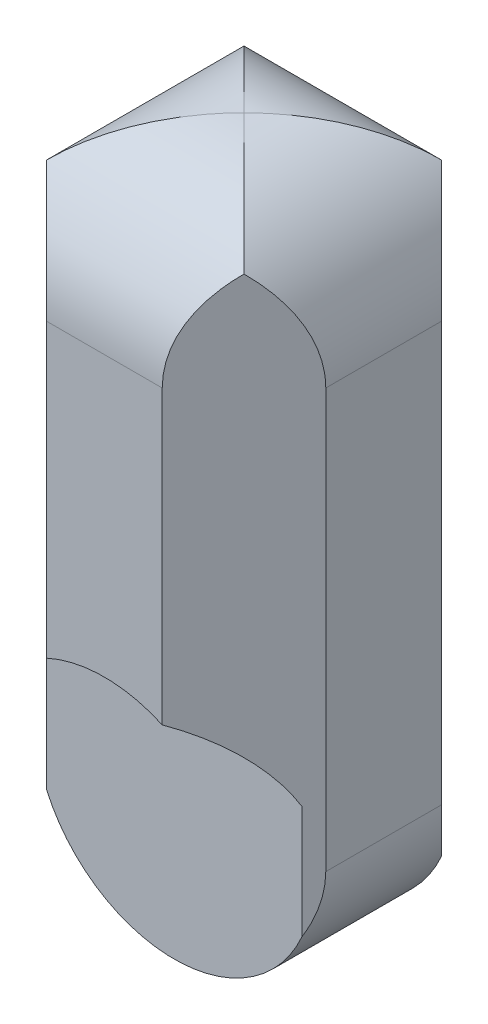
ISO-10303-21;
HEADER;
FILE_DESCRIPTION(('STEP AP214'),'2;1');
FILE_NAME('part.step','',(''),(''),'','','');
FILE_SCHEMA(('AUTOMOTIVE_DESIGN { 1 0 10303 214 1 1 1 1 }'));
ENDSEC;
DATA;
#1=APPLICATION_CONTEXT('core data for automotive mechanical design processes');
#2=APPLICATION_PROTOCOL_DEFINITION('international standard','automotive_design',2000,#1);
#3=PRODUCT_CONTEXT('',#1,'mechanical');
#4=PRODUCT('Part','Part','',(#3));
#5=PRODUCT_RELATED_PRODUCT_CATEGORY('part','',(#4));
#6=PRODUCT_DEFINITION_FORMATION('','',#4);
#7=PRODUCT_DEFINITION_CONTEXT('part definition',#1,'design');
#8=PRODUCT_DEFINITION('design','',#6,#7);
#9=PRODUCT_DEFINITION_SHAPE('','',#8);
#10=(LENGTH_UNIT() NAMED_UNIT(*) SI_UNIT(.MILLI.,.METRE.));
#11=(NAMED_UNIT(*) PLANE_ANGLE_UNIT() SI_UNIT($,.RADIAN.));
#12=(NAMED_UNIT(*) SI_UNIT($,.STERADIAN.) SOLID_ANGLE_UNIT());
#13=UNCERTAINTY_MEASURE_WITH_UNIT(LENGTH_MEASURE(1.E-05),#10,'distance_accuracy_value','');
#14=(GEOMETRIC_REPRESENTATION_CONTEXT(3) GLOBAL_UNCERTAINTY_ASSIGNED_CONTEXT((#13)) GLOBAL_UNIT_ASSIGNED_CONTEXT((#10,
#11,#12)) REPRESENTATION_CONTEXT('',''));
#15=CARTESIAN_POINT('',(0.,0.,0.));
#16=DIRECTION('',(0.,0.,1.));
#17=DIRECTION('',(1.,0.,0.));
#18=AXIS2_PLACEMENT_3D('',#15,#16,#17);
#19=CARTESIAN_POINT('',(-3.31370849898476,40.,8.));
#20=DIRECTION('',(0.,0.,-1.));
#21=DIRECTION('',(-1.,0.,0.));
#22=AXIS2_PLACEMENT_3D('',#19,#20,#21);
#23=PLANE('',#22);
#24=DIRECTION('',(-1.,0.,0.));
#25=VECTOR('',#24,1.);
#26=CARTESIAN_POINT('',(92.,32.,7.99999999999997));
#27=LINE('',#26,#25);
#28=CARTESIAN_POINT('',(3.31370849898477,32.,8.));
#29=VERTEX_POINT('',#28);
#30=CARTESIAN_POINT('',(-3.31370849898477,32.,8.));
#31=VERTEX_POINT('',#30);
#32=EDGE_CURVE('E142',#29,#31,#27,.T.);
#33=ORIENTED_EDGE('',*,*,#32,.T.);
#34=DIRECTION('',(0.,-1.,0.));
#35=VECTOR('',#34,1.);
#36=CARTESIAN_POINT('',(-3.31370849898476,40.,8.));
#37=LINE('',#36,#35);
#38=CARTESIAN_POINT('',(-3.31370849898476,15.2814377689956,8.));
#39=VERTEX_POINT('',#38);
#40=EDGE_CURVE('E166',#31,#39,#37,.T.);
#41=ORIENTED_EDGE('',*,*,#40,.T.);
#42=CARTESIAN_POINT('',(0.,8.,8.));
#43=DIRECTION('',(0.,0.,1.));
#44=DIRECTION('',(1.,0.,0.));
#45=AXIS2_PLACEMENT_3D('',#42,#43,#44);
#46=CIRCLE('',#45,8.);
#47=CARTESIAN_POINT('',(3.31370849898477,15.2814377689956,8.));
#48=VERTEX_POINT('',#47);
#49=EDGE_CURVE('E165',#48,#39,#46,.T.);
#50=ORIENTED_EDGE('',*,*,#49,.F.);
#51=DIRECTION('',(0.,-1.,0.));
#52=VECTOR('',#51,1.);
#53=CARTESIAN_POINT('',(3.31370849898477,40.,8.));
#54=LINE('',#53,#52);
#55=EDGE_CURVE('E158',#29,#48,#54,.T.);
#56=ORIENTED_EDGE('',*,*,#55,.F.);
#57=EDGE_LOOP('',(#33,#41,#50,#56));
#58=FACE_BOUND('',#57,.T.);
#59=ADVANCED_FACE('F38',(#58),#23,.F.);
#60=CARTESIAN_POINT('',(0.,32.,92.));
#61=DIRECTION('',(0.,0.,-1.));
#62=DIRECTION('',(-1.,0.,0.));
#63=AXIS2_PLACEMENT_3D('',#60,#61,#62);
#64=CYLINDRICAL_SURFACE('',#63,8.);
#65=CARTESIAN_POINT('',(0.,32.,11.3137084989848));
#66=DIRECTION('',(0.707106781186547,0.,-0.707106781186548));
#67=DIRECTION('',(-0.707106781186548,0.,-0.707106781186547));
#68=AXIS2_PLACEMENT_3D('',#65,#66,#67);
#69=ELLIPSE('',#68,11.3137084989848,8.);
#70=CARTESIAN_POINT('',(-5.65685424949239,37.6568542494924,5.65685424949238));
#71=VERTEX_POINT('',#70);
#72=CARTESIAN_POINT('',(-8.,32.,3.31370849898477));
#73=VERTEX_POINT('',#72);
#74=EDGE_CURVE('E202',#71,#73,#69,.F.);
#75=ORIENTED_EDGE('',*,*,#74,.F.);
#76=CARTESIAN_POINT('',(0.,32.,0.));
#77=DIRECTION('',(-0.707106781186548,0.,-0.707106781186547));
#78=DIRECTION('',(0.707106781186547,0.,-0.707106781186548));
#79=AXIS2_PLACEMENT_3D('',#76,#77,#78);
#80=ELLIPSE('',#79,11.3137084989848,8.);
#81=CARTESIAN_POINT('',(0.,40.,0.));
#82=VERTEX_POINT('',#81);
#83=EDGE_CURVE('E46',#71,#82,#80,.T.);
#84=ORIENTED_EDGE('',*,*,#83,.T.);
#85=CARTESIAN_POINT('',(0.,32.,0.));
#86=DIRECTION('',(0.707106781186547,0.,-0.707106781186548));
#87=DIRECTION('',(-0.707106781186548,0.,-0.707106781186547));
#88=AXIS2_PLACEMENT_3D('',#85,#86,#87);
#89=ELLIPSE('',#88,11.3137084989848,8.);
#90=CARTESIAN_POINT('',(-5.65685424949238,37.6568542494924,-5.65685424949239));
#91=VERTEX_POINT('',#90);
#92=EDGE_CURVE('E193',#82,#91,#89,.F.);
#93=ORIENTED_EDGE('',*,*,#92,.T.);
#94=CARTESIAN_POINT('',(0.,32.,-11.3137084989848));
#95=DIRECTION('',(0.707106781186547,0.,0.707106781186548));
#96=DIRECTION('',(0.707106781186548,0.,-0.707106781186547));
#97=AXIS2_PLACEMENT_3D('',#94,#95,#96);
#98=ELLIPSE('',#97,11.3137084989848,8.);
#99=CARTESIAN_POINT('',(-8.,32.,-3.31370849898477));
#100=VERTEX_POINT('',#99);
#101=EDGE_CURVE('E227',#100,#91,#98,.F.);
#102=ORIENTED_EDGE('',*,*,#101,.F.);
#103=DIRECTION('',(0.,0.,-1.));
#104=VECTOR('',#103,1.);
#105=CARTESIAN_POINT('',(-7.99999999999995,32.,92.));
#106=LINE('',#105,#104);
#107=EDGE_CURVE('E216',#73,#100,#106,.T.);
#108=ORIENTED_EDGE('',*,*,#107,.F.);
#109=EDGE_LOOP('',(#75,#84,#93,#102,#108));
#110=FACE_BOUND('',#109,.T.);
#111=ADVANCED_FACE('F199',(#110),#64,.T.);
#112=CARTESIAN_POINT('',(3.31370849898476,40.,-8.));
#113=DIRECTION('',(0.,0.,1.));
#114=DIRECTION('',(1.,0.,0.));
#115=AXIS2_PLACEMENT_3D('',#112,#113,#114);
#116=PLANE('',#115);
#117=DIRECTION('',(0.,-1.,0.));
#118=VECTOR('',#117,1.);
#119=CARTESIAN_POINT('',(-3.31370849898477,40.,-8.));
#120=LINE('',#119,#118);
#121=CARTESIAN_POINT('',(-3.31370849898477,32.,-8.));
#122=VERTEX_POINT('',#121);
#123=CARTESIAN_POINT('',(-3.31370849898477,15.2814377689956,-8.));
#124=VERTEX_POINT('',#123);
#125=EDGE_CURVE('E178',#122,#124,#120,.T.);
#126=ORIENTED_EDGE('',*,*,#125,.F.);
#127=DIRECTION('',(-1.,0.,0.));
#128=VECTOR('',#127,1.);
#129=CARTESIAN_POINT('',(92.,32.,-8.00000000000003));
#130=LINE('',#129,#128);
#131=CARTESIAN_POINT('',(3.31370849898475,32.,-8.));
#132=VERTEX_POINT('',#131);
#133=EDGE_CURVE('E152',#132,#122,#130,.T.);
#134=ORIENTED_EDGE('',*,*,#133,.F.);
#135=DIRECTION('',(0.,-1.,0.));
#136=VECTOR('',#135,1.);
#137=CARTESIAN_POINT('',(3.31370849898476,40.,-8.));
#138=LINE('',#137,#136);
#139=CARTESIAN_POINT('',(3.31370849898476,15.2814377689956,-8.));
#140=VERTEX_POINT('',#139);
#141=EDGE_CURVE('E180',#132,#140,#138,.T.);
#142=ORIENTED_EDGE('',*,*,#141,.T.);
#143=CARTESIAN_POINT('',(0.,8.,-8.));
#144=DIRECTION('',(0.,0.,-1.));
#145=DIRECTION('',(-1.,0.,0.));
#146=AXIS2_PLACEMENT_3D('',#143,#144,#145);
#147=CIRCLE('',#146,8.);
#148=EDGE_CURVE('E230',#124,#140,#147,.T.);
#149=ORIENTED_EDGE('',*,*,#148,.F.);
#150=EDGE_LOOP('',(#126,#134,#142,#149));
#151=FACE_BOUND('',#150,.T.);
#152=ADVANCED_FACE('F298',(#151),#116,.F.);
#153=CARTESIAN_POINT('',(-8.,40.,-3.31370849898476));
#154=DIRECTION('',(1.,0.,0.));
#155=DIRECTION('',(0.,0.,-1.));
#156=AXIS2_PLACEMENT_3D('',#153,#154,#155);
#157=PLANE('',#156);
#158=ORIENTED_EDGE('',*,*,#107,.T.);
#159=DIRECTION('',(0.,-1.,0.));
#160=VECTOR('',#159,1.);
#161=CARTESIAN_POINT('',(-8.,40.,-3.31370849898476));
#162=LINE('',#161,#160);
#163=CARTESIAN_POINT('',(-8.,8.,-3.31370849898476));
#164=VERTEX_POINT('',#163);
#165=EDGE_CURVE('E176',#100,#164,#162,.T.);
#166=ORIENTED_EDGE('',*,*,#165,.T.);
#167=DIRECTION('',(0.,0.,1.));
#168=VECTOR('',#167,1.);
#169=CARTESIAN_POINT('',(-8.,8.,-8.));
#170=LINE('',#169,#168);
#171=CARTESIAN_POINT('',(-8.,8.,3.31370849898477));
#172=VERTEX_POINT('',#171);
#173=EDGE_CURVE('E251',#164,#172,#170,.T.);
#174=ORIENTED_EDGE('',*,*,#173,.T.);
#175=DIRECTION('',(0.,-1.,0.));
#176=VECTOR('',#175,1.);
#177=CARTESIAN_POINT('',(-8.,40.,3.31370849898477));
#178=LINE('',#177,#176);
#179=EDGE_CURVE('E169',#73,#172,#178,.T.);
#180=ORIENTED_EDGE('',*,*,#179,.F.);
#181=EDGE_LOOP('',(#158,#166,#174,#180));
#182=FACE_BOUND('',#181,.T.);
#183=ADVANCED_FACE('F286',(#182),#157,.F.);
#184=CARTESIAN_POINT('',(0.,8.,-8.));
#185=DIRECTION('',(0.,0.,1.));
#186=DIRECTION('',(1.,0.,0.));
#187=AXIS2_PLACEMENT_3D('',#184,#185,#186);
#188=CYLINDRICAL_SURFACE('',#187,8.);
#189=CARTESIAN_POINT('',(0.,8.,-4.));
#190=DIRECTION('',(0.,0.,-1.));
#191=DIRECTION('',(-1.,0.,0.));
#192=AXIS2_PLACEMENT_3D('',#189,#190,#191);
#193=CIRCLE('',#192,8.);
#194=CARTESIAN_POINT('',(7.31370849898476,4.75813819050254,-4.));
#195=VERTEX_POINT('',#194);
#196=CARTESIAN_POINT('',(-7.31370849898477,4.75813819050257,-4.));
#197=VERTEX_POINT('',#196);
#198=EDGE_CURVE('E61',#195,#197,#193,.T.);
#199=ORIENTED_EDGE('',*,*,#198,.F.);
#200=CARTESIAN_POINT('',(0.,8.,-11.3137084989848));
#201=DIRECTION('',(-0.707106781186547,0.,0.707106781186548));
#202=DIRECTION('',(0.707106781186548,0.,0.707106781186547));
#203=AXIS2_PLACEMENT_3D('',#200,#201,#202);
#204=ELLIPSE('',#203,11.3137084989848,8.);
#205=CARTESIAN_POINT('',(8.,8.,-3.31370849898476));
#206=VERTEX_POINT('',#205);
#207=EDGE_CURVE('E171',#206,#195,#204,.F.);
#208=ORIENTED_EDGE('',*,*,#207,.F.);
#209=DIRECTION('',(0.,0.,1.));
#210=VECTOR('',#209,1.);
#211=CARTESIAN_POINT('',(8.,8.,-8.));
#212=LINE('',#211,#210);
#213=CARTESIAN_POINT('',(8.,8.,3.31370849898476));
#214=VERTEX_POINT('',#213);
#215=EDGE_CURVE('E252',#206,#214,#212,.T.);
#216=ORIENTED_EDGE('',*,*,#215,.T.);
#217=CARTESIAN_POINT('',(0.,8.,11.3137084989848));
#218=DIRECTION('',(-0.707106781186548,0.,-0.707106781186548));
#219=DIRECTION('',(-0.707106781186548,0.,0.707106781186548));
#220=AXIS2_PLACEMENT_3D('',#217,#218,#219);
#221=ELLIPSE('',#220,11.3137084989848,8.);
#222=CARTESIAN_POINT('',(7.31370849898476,4.75813819050256,4.));
#223=VERTEX_POINT('',#222);
#224=EDGE_CURVE('E255',#223,#214,#221,.F.);
#225=ORIENTED_EDGE('',*,*,#224,.F.);
#226=CARTESIAN_POINT('',(0.,8.,4.));
#227=DIRECTION('',(0.,0.,1.));
#228=DIRECTION('',(1.,0.,0.));
#229=AXIS2_PLACEMENT_3D('',#226,#227,#228);
#230=CIRCLE('',#229,8.);
#231=CARTESIAN_POINT('',(-7.31370849898477,4.75813819050256,4.));
#232=VERTEX_POINT('',#231);
#233=EDGE_CURVE('E184',#232,#223,#230,.T.);
#234=ORIENTED_EDGE('',*,*,#233,.F.);
#235=CARTESIAN_POINT('',(0.,8.,11.3137084989848));
#236=DIRECTION('',(0.707106781186547,0.,-0.707106781186548));
#237=DIRECTION('',(0.707106781186548,0.,0.707106781186547));
#238=AXIS2_PLACEMENT_3D('',#235,#236,#237);
#239=ELLIPSE('',#238,11.3137084989848,8.);
#240=EDGE_CURVE('E260',#172,#232,#239,.F.);
#241=ORIENTED_EDGE('',*,*,#240,.F.);
#242=ORIENTED_EDGE('',*,*,#173,.F.);
#243=CARTESIAN_POINT('',(0.,8.,-11.3137084989848));
#244=DIRECTION('',(0.707106781186547,0.,0.707106781186548));
#245=DIRECTION('',(-0.707106781186548,0.,0.707106781186547));
#246=AXIS2_PLACEMENT_3D('',#243,#244,#245);
#247=ELLIPSE('',#246,11.3137084989848,8.);
#248=EDGE_CURVE('E263',#197,#164,#247,.F.);
#249=ORIENTED_EDGE('',*,*,#248,.F.);
#250=EDGE_LOOP('',(#199,#208,#216,#225,#234,#241,#242,#249));
#251=FACE_BOUND('',#250,.T.);
#252=ADVANCED_FACE('F271',(#251),#188,.T.);
#253=CARTESIAN_POINT('',(8.,40.,3.31370849898476));
#254=DIRECTION('',(-1.,0.,0.));
#255=DIRECTION('',(0.,0.,1.));
#256=AXIS2_PLACEMENT_3D('',#253,#254,#255);
#257=PLANE('',#256);
#258=DIRECTION('',(0.,-1.,0.));
#259=VECTOR('',#258,1.);
#260=CARTESIAN_POINT('',(8.,40.,-3.31370849898476));
#261=LINE('',#260,#259);
#262=CARTESIAN_POINT('',(8.,32.,-3.31370849898477));
#263=VERTEX_POINT('',#262);
#264=EDGE_CURVE('E182',#263,#206,#261,.T.);
#265=ORIENTED_EDGE('',*,*,#264,.F.);
#266=DIRECTION('',(0.,0.,-1.));
#267=VECTOR('',#266,1.);
#268=CARTESIAN_POINT('',(8.00000000000005,32.,92.));
#269=LINE('',#268,#267);
#270=CARTESIAN_POINT('',(8.00000000000001,32.,3.31370849898475));
#271=VERTEX_POINT('',#270);
#272=EDGE_CURVE('E219',#271,#263,#269,.T.);
#273=ORIENTED_EDGE('',*,*,#272,.F.);
#274=DIRECTION('',(0.,-1.,0.));
#275=VECTOR('',#274,1.);
#276=CARTESIAN_POINT('',(8.,40.,3.31370849898476));
#277=LINE('',#276,#275);
#278=EDGE_CURVE('E167',#271,#214,#277,.T.);
#279=ORIENTED_EDGE('',*,*,#278,.T.);
#280=ORIENTED_EDGE('',*,*,#215,.F.);
#281=EDGE_LOOP('',(#265,#273,#279,#280));
#282=FACE_BOUND('',#281,.T.);
#283=ADVANCED_FACE('F40',(#282),#257,.F.);
#284=CARTESIAN_POINT('',(8.,40.,-3.31370849898476));
#285=DIRECTION('',(-0.707106781186547,0.,0.707106781186548));
#286=DIRECTION('',(0.707106781186548,0.,0.707106781186547));
#287=AXIS2_PLACEMENT_3D('',#284,#285,#286);
#288=PLANE('',#287);
#289=ORIENTED_EDGE('',*,*,#141,.F.);
#290=CARTESIAN_POINT('',(11.3137084989848,32.,0.));
#291=DIRECTION('',(-0.707106781186547,0.,0.707106781186548));
#292=DIRECTION('',(-0.707106781186548,0.,-0.707106781186547));
#293=AXIS2_PLACEMENT_3D('',#290,#291,#292);
#294=ELLIPSE('',#293,11.3137084989848,8.);
#295=CARTESIAN_POINT('',(5.65685424949237,37.6568542494924,-5.65685424949238));
#296=VERTEX_POINT('',#295);
#297=EDGE_CURVE('E210',#132,#296,#294,.F.);
#298=ORIENTED_EDGE('',*,*,#297,.T.);
#299=CARTESIAN_POINT('',(0.,32.,-11.3137084989848));
#300=DIRECTION('',(-0.707106781186547,0.,0.707106781186548));
#301=DIRECTION('',(-0.707106781186548,0.,-0.707106781186547));
#302=AXIS2_PLACEMENT_3D('',#299,#300,#301);
#303=ELLIPSE('',#302,11.3137084989848,8.);
#304=EDGE_CURVE('E207',#296,#263,#303,.F.);
#305=ORIENTED_EDGE('',*,*,#304,.T.);
#306=ORIENTED_EDGE('',*,*,#264,.T.);
#307=ORIENTED_EDGE('',*,*,#207,.T.);
#308=DIRECTION('',(0.,-1.,0.));
#309=VECTOR('',#308,1.);
#310=CARTESIAN_POINT('',(7.31370849898476,40.,-4.));
#311=LINE('',#310,#309);
#312=CARTESIAN_POINT('',(7.31370849898476,11.2418618094975,-4.));
#313=VERTEX_POINT('',#312);
#314=EDGE_CURVE('E234',#313,#195,#311,.T.);
#315=ORIENTED_EDGE('',*,*,#314,.F.);
#316=CARTESIAN_POINT('',(0.,8.,-11.3137084989848));
#317=DIRECTION('',(-0.707106781186547,0.,0.707106781186548));
#318=DIRECTION('',(-0.707106781186548,0.,-0.707106781186547));
#319=AXIS2_PLACEMENT_3D('',#316,#317,#318);
#320=ELLIPSE('',#319,11.3137084989848,8.);
#321=EDGE_CURVE('E238',#313,#140,#320,.T.);
#322=ORIENTED_EDGE('',*,*,#321,.T.);
#323=EDGE_LOOP('',(#289,#298,#305,#306,#307,#315,#322));
#324=FACE_BOUND('',#323,.T.);
#325=ADVANCED_FACE('F214',(#324),#288,.F.);
#326=CARTESIAN_POINT('',(-3.31370849898477,40.,-8.));
#327=DIRECTION('',(0.707106781186547,0.,0.707106781186548));
#328=DIRECTION('',(0.707106781186548,0.,-0.707106781186547));
#329=AXIS2_PLACEMENT_3D('',#326,#327,#328);
#330=PLANE('',#329);
#331=ORIENTED_EDGE('',*,*,#101,.T.);
#332=CARTESIAN_POINT('',(-11.3137084989848,32.,0.));
#333=DIRECTION('',(0.707106781186547,0.,0.707106781186548));
#334=DIRECTION('',(-0.707106781186548,0.,0.707106781186547));
#335=AXIS2_PLACEMENT_3D('',#332,#333,#334);
#336=ELLIPSE('',#335,11.3137084989848,8.);
#337=EDGE_CURVE('E53',#91,#122,#336,.F.);
#338=ORIENTED_EDGE('',*,*,#337,.T.);
#339=ORIENTED_EDGE('',*,*,#125,.T.);
#340=CARTESIAN_POINT('',(0.,8.,-11.3137084989848));
#341=DIRECTION('',(0.707106781186547,0.,0.707106781186548));
#342=DIRECTION('',(0.707106781186548,0.,-0.707106781186547));
#343=AXIS2_PLACEMENT_3D('',#340,#341,#342);
#344=ELLIPSE('',#343,11.3137084989848,8.);
#345=CARTESIAN_POINT('',(-7.31370849898477,11.2418618094974,-4.));
#346=VERTEX_POINT('',#345);
#347=EDGE_CURVE('E190',#124,#346,#344,.T.);
#348=ORIENTED_EDGE('',*,*,#347,.T.);
#349=DIRECTION('',(0.,1.,0.));
#350=VECTOR('',#349,1.);
#351=CARTESIAN_POINT('',(-7.31370849898477,40.,-4.));
#352=LINE('',#351,#350);
#353=EDGE_CURVE('E188',#197,#346,#352,.T.);
#354=ORIENTED_EDGE('',*,*,#353,.F.);
#355=ORIENTED_EDGE('',*,*,#248,.T.);
#356=ORIENTED_EDGE('',*,*,#165,.F.);
#357=EDGE_LOOP('',(#331,#338,#339,#348,#354,#355,#356));
#358=FACE_BOUND('',#357,.T.);
#359=ADVANCED_FACE('F289',(#358),#330,.F.);
#360=CARTESIAN_POINT('',(-8.,40.,3.31370849898477));
#361=DIRECTION('',(0.707106781186547,0.,-0.707106781186548));
#362=DIRECTION('',(-0.707106781186548,0.,-0.707106781186547));
#363=AXIS2_PLACEMENT_3D('',#360,#361,#362);
#364=PLANE('',#363);
#365=ORIENTED_EDGE('',*,*,#40,.F.);
#366=CARTESIAN_POINT('',(-11.3137084989848,32.,0.));
#367=DIRECTION('',(0.707106781186547,0.,-0.707106781186548));
#368=DIRECTION('',(-0.707106781186548,0.,-0.707106781186547));
#369=AXIS2_PLACEMENT_3D('',#366,#367,#368);
#370=ELLIPSE('',#369,11.3137084989848,8.);
#371=EDGE_CURVE('E148',#31,#71,#370,.F.);
#372=ORIENTED_EDGE('',*,*,#371,.T.);
#373=ORIENTED_EDGE('',*,*,#74,.T.);
#374=ORIENTED_EDGE('',*,*,#179,.T.);
#375=ORIENTED_EDGE('',*,*,#240,.T.);
#376=DIRECTION('',(0.,-1.,0.));
#377=VECTOR('',#376,1.);
#378=CARTESIAN_POINT('',(-7.31370849898477,40.,4.));
#379=LINE('',#378,#377);
#380=CARTESIAN_POINT('',(-7.31370849898477,11.2418618094974,4.));
#381=VERTEX_POINT('',#380);
#382=EDGE_CURVE('E246',#381,#232,#379,.T.);
#383=ORIENTED_EDGE('',*,*,#382,.F.);
#384=CARTESIAN_POINT('',(0.,8.,11.3137084989848));
#385=DIRECTION('',(0.707106781186547,0.,-0.707106781186548));
#386=DIRECTION('',(0.707106781186548,0.,0.707106781186547));
#387=AXIS2_PLACEMENT_3D('',#384,#385,#386);
#388=ELLIPSE('',#387,11.3137084989848,8.);
#389=EDGE_CURVE('E248',#381,#39,#388,.T.);
#390=ORIENTED_EDGE('',*,*,#389,.T.);
#391=EDGE_LOOP('',(#365,#372,#373,#374,#375,#383,#390));
#392=FACE_BOUND('',#391,.T.);
#393=ADVANCED_FACE('F283',(#392),#364,.F.);
#394=CARTESIAN_POINT('',(3.31370849898477,40.,8.));
#395=DIRECTION('',(-0.707106781186548,0.,-0.707106781186548));
#396=DIRECTION('',(-0.707106781186548,0.,0.707106781186548));
#397=AXIS2_PLACEMENT_3D('',#394,#395,#396);
#398=PLANE('',#397);
#399=CARTESIAN_POINT('',(0.,32.,11.3137084989848));
#400=DIRECTION('',(-0.707106781186548,0.,-0.707106781186548));
#401=DIRECTION('',(0.707106781186548,0.,-0.707106781186548));
#402=AXIS2_PLACEMENT_3D('',#399,#400,#401);
#403=ELLIPSE('',#402,11.3137084989848,8.);
#404=CARTESIAN_POINT('',(5.65685424949239,37.6568542494924,5.65685424949238));
#405=VERTEX_POINT('',#404);
#406=EDGE_CURVE('E161',#271,#405,#403,.F.);
#407=ORIENTED_EDGE('',*,*,#406,.T.);
#408=CARTESIAN_POINT('',(11.3137084989848,32.,0.));
#409=DIRECTION('',(-0.707106781186548,0.,-0.707106781186548));
#410=DIRECTION('',(-0.707106781186548,0.,0.707106781186548));
#411=AXIS2_PLACEMENT_3D('',#408,#409,#410);
#412=ELLIPSE('',#411,11.3137084989848,8.);
#413=EDGE_CURVE('E145',#405,#29,#412,.F.);
#414=ORIENTED_EDGE('',*,*,#413,.T.);
#415=ORIENTED_EDGE('',*,*,#55,.T.);
#416=CARTESIAN_POINT('',(0.,8.,11.3137084989848));
#417=DIRECTION('',(-0.707106781186548,0.,-0.707106781186548));
#418=DIRECTION('',(-0.707106781186548,0.,0.707106781186548));
#419=AXIS2_PLACEMENT_3D('',#416,#417,#418);
#420=ELLIPSE('',#419,11.3137084989848,8.);
#421=CARTESIAN_POINT('',(7.31370849898477,11.2418618094974,4.));
#422=VERTEX_POINT('',#421);
#423=EDGE_CURVE('E186',#48,#422,#420,.T.);
#424=ORIENTED_EDGE('',*,*,#423,.T.);
#425=DIRECTION('',(0.,1.,0.));
#426=VECTOR('',#425,1.);
#427=CARTESIAN_POINT('',(7.31370849898477,40.,4.));
#428=LINE('',#427,#426);
#429=EDGE_CURVE('E243',#223,#422,#428,.T.);
#430=ORIENTED_EDGE('',*,*,#429,.F.);
#431=ORIENTED_EDGE('',*,*,#224,.T.);
#432=ORIENTED_EDGE('',*,*,#278,.F.);
#433=EDGE_LOOP('',(#407,#414,#415,#424,#430,#431,#432));
#434=FACE_BOUND('',#433,.T.);
#435=ADVANCED_FACE('F156',(#434),#398,.F.);
#436=CARTESIAN_POINT('',(0.,8.,4.));
#437=DIRECTION('',(0.,0.,1.));
#438=DIRECTION('',(1.,0.,0.));
#439=AXIS2_PLACEMENT_3D('',#436,#437,#438);
#440=CYLINDRICAL_SURFACE('',#439,8.);
#441=CARTESIAN_POINT('',(0.,8.,4.));
#442=DIRECTION('',(0.,0.,1.));
#443=DIRECTION('',(1.,0.,0.));
#444=AXIS2_PLACEMENT_3D('',#441,#442,#443);
#445=CIRCLE('',#444,8.);
#446=EDGE_CURVE('E240',#422,#381,#445,.T.);
#447=ORIENTED_EDGE('',*,*,#446,.F.);
#448=ORIENTED_EDGE('',*,*,#423,.F.);
#449=ORIENTED_EDGE('',*,*,#49,.T.);
#450=ORIENTED_EDGE('',*,*,#389,.F.);
#451=EDGE_LOOP('',(#447,#448,#449,#450));
#452=FACE_BOUND('',#451,.T.);
#453=ADVANCED_FACE('F330',(#452),#440,.F.);
#454=CARTESIAN_POINT('',(0.,8.,4.));
#455=DIRECTION('',(0.,0.,1.));
#456=DIRECTION('',(1.,0.,0.));
#457=AXIS2_PLACEMENT_3D('',#454,#455,#456);
#458=PLANE('',#457);
#459=ORIENTED_EDGE('',*,*,#382,.T.);
#460=ORIENTED_EDGE('',*,*,#233,.T.);
#461=ORIENTED_EDGE('',*,*,#429,.T.);
#462=ORIENTED_EDGE('',*,*,#446,.T.);
#463=EDGE_LOOP('',(#459,#460,#461,#462));
#464=FACE_BOUND('',#463,.T.);
#465=ADVANCED_FACE('F333',(#464),#458,.T.);
#466=CARTESIAN_POINT('',(0.,8.,-4.));
#467=DIRECTION('',(0.,0.,-1.));
#468=DIRECTION('',(-1.,0.,0.));
#469=AXIS2_PLACEMENT_3D('',#466,#467,#468);
#470=CYLINDRICAL_SURFACE('',#469,8.);
#471=EDGE_CURVE('E231',#346,#313,#193,.T.);
#472=ORIENTED_EDGE('',*,*,#471,.F.);
#473=ORIENTED_EDGE('',*,*,#347,.F.);
#474=ORIENTED_EDGE('',*,*,#148,.T.);
#475=ORIENTED_EDGE('',*,*,#321,.F.);
#476=EDGE_LOOP('',(#472,#473,#474,#475));
#477=FACE_BOUND('',#476,.T.);
#478=ADVANCED_FACE('F294',(#477),#470,.F.);
#479=CARTESIAN_POINT('',(0.,8.,-4.));
#480=DIRECTION('',(0.,0.,-1.));
#481=DIRECTION('',(-1.,0.,0.));
#482=AXIS2_PLACEMENT_3D('',#479,#480,#481);
#483=PLANE('',#482);
#484=ORIENTED_EDGE('',*,*,#314,.T.);
#485=ORIENTED_EDGE('',*,*,#198,.T.);
#486=ORIENTED_EDGE('',*,*,#353,.T.);
#487=ORIENTED_EDGE('',*,*,#471,.T.);
#488=EDGE_LOOP('',(#484,#485,#486,#487));
#489=FACE_BOUND('',#488,.T.);
#490=ADVANCED_FACE('F292',(#489),#483,.T.);
#491=ORIENTED_EDGE('',*,*,#304,.F.);
#492=CARTESIAN_POINT('',(0.,32.,0.));
#493=DIRECTION('',(-0.707106781186548,0.,-0.707106781186547));
#494=DIRECTION('',(0.707106781186547,0.,-0.707106781186548));
#495=AXIS2_PLACEMENT_3D('',#492,#493,#494);
#496=ELLIPSE('',#495,11.3137084989848,8.);
#497=EDGE_CURVE('E11',#296,#82,#496,.F.);
#498=ORIENTED_EDGE('',*,*,#497,.T.);
#499=CARTESIAN_POINT('',(0.,32.,0.));
#500=DIRECTION('',(0.707106781186547,0.,-0.707106781186548));
#501=DIRECTION('',(-0.707106781186548,0.,-0.707106781186547));
#502=AXIS2_PLACEMENT_3D('',#499,#500,#501);
#503=ELLIPSE('',#502,11.3137084989848,8.);
#504=EDGE_CURVE('E195',#82,#405,#503,.T.);
#505=ORIENTED_EDGE('',*,*,#504,.T.);
#506=ORIENTED_EDGE('',*,*,#406,.F.);
#507=ORIENTED_EDGE('',*,*,#272,.T.);
#508=EDGE_LOOP('',(#491,#498,#505,#506,#507));
#509=FACE_BOUND('',#508,.T.);
#510=ADVANCED_FACE('F205',(#509),#64,.T.);
#511=CARTESIAN_POINT('',(92.,32.,0.));
#512=DIRECTION('',(-1.,0.,0.));
#513=DIRECTION('',(0.,0.,1.));
#514=AXIS2_PLACEMENT_3D('',#511,#512,#513);
#515=CYLINDRICAL_SURFACE('',#514,8.);
#516=ORIENTED_EDGE('',*,*,#133,.T.);
#517=ORIENTED_EDGE('',*,*,#337,.F.);
#518=ORIENTED_EDGE('',*,*,#92,.F.);
#519=ORIENTED_EDGE('',*,*,#497,.F.);
#520=ORIENTED_EDGE('',*,*,#297,.F.);
#521=EDGE_LOOP('',(#516,#517,#518,#519,#520));
#522=FACE_BOUND('',#521,.T.);
#523=ADVANCED_FACE('F209',(#522),#515,.T.);
#524=ORIENTED_EDGE('',*,*,#32,.F.);
#525=ORIENTED_EDGE('',*,*,#413,.F.);
#526=ORIENTED_EDGE('',*,*,#504,.F.);
#527=ORIENTED_EDGE('',*,*,#83,.F.);
#528=ORIENTED_EDGE('',*,*,#371,.F.);
#529=EDGE_LOOP('',(#524,#525,#526,#527,#528));
#530=FACE_BOUND('',#529,.T.);
#531=ADVANCED_FACE('F144',(#530),#515,.T.);
#532=CLOSED_SHELL('',(#59,#111,#152,#183,#252,#283,#325,#359,#393,#435,#453,#465,#478,#490,#510,
#523,#531));
#533=MANIFOLD_SOLID_BREP('B2',#532);
#534=ADVANCED_BREP_SHAPE_REPRESENTATION('',(#18,#533),#14);
#535=SHAPE_DEFINITION_REPRESENTATION(#9,#534);
ENDSEC;
END-ISO-10303-21;
